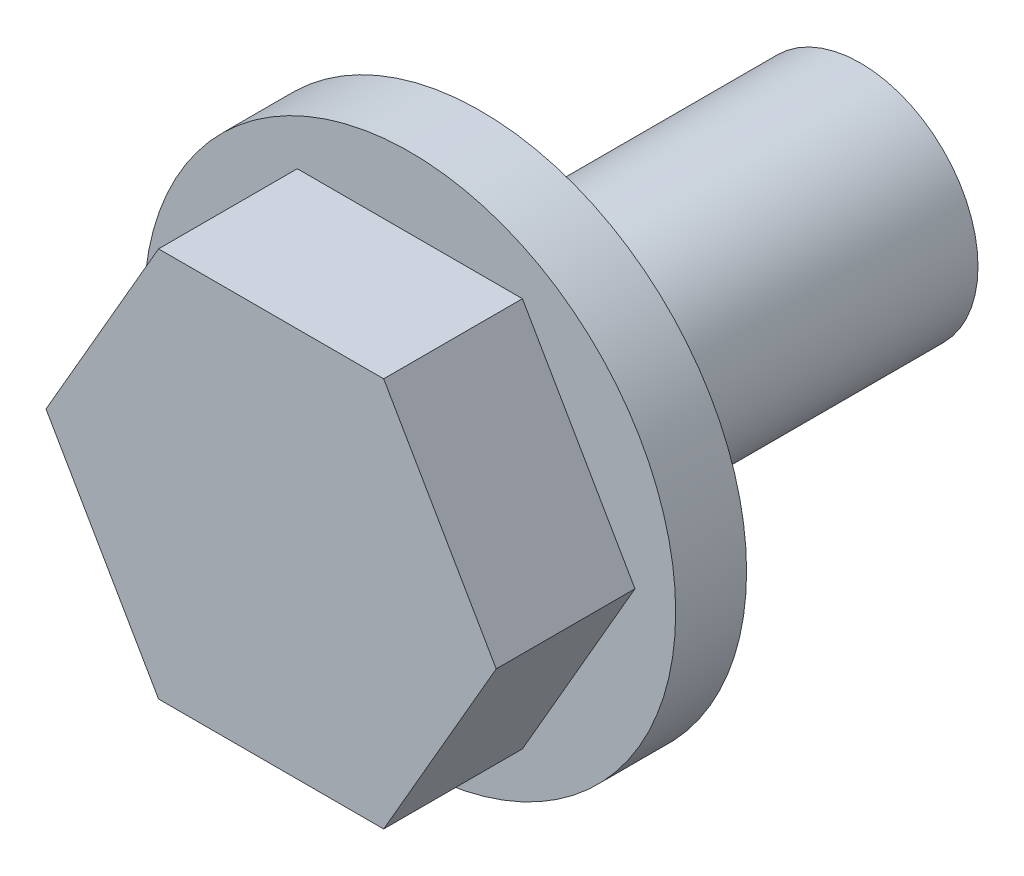
ISO-10303-21;
HEADER;
FILE_DESCRIPTION(('STEP AP214'),'2;1');
FILE_NAME('part.step','',(''),(''),'','','');
FILE_SCHEMA(('AUTOMOTIVE_DESIGN { 1 0 10303 214 1 1 1 1 }'));
ENDSEC;
DATA;
#1=APPLICATION_CONTEXT('core data for automotive mechanical design processes');
#2=APPLICATION_PROTOCOL_DEFINITION('international standard','automotive_design',2000,#1);
#3=PRODUCT_CONTEXT('',#1,'mechanical');
#4=PRODUCT('Part','Part','',(#3));
#5=PRODUCT_RELATED_PRODUCT_CATEGORY('part','',(#4));
#6=PRODUCT_DEFINITION_FORMATION('','',#4);
#7=PRODUCT_DEFINITION_CONTEXT('part definition',#1,'design');
#8=PRODUCT_DEFINITION('design','',#6,#7);
#9=PRODUCT_DEFINITION_SHAPE('','',#8);
#10=(LENGTH_UNIT() NAMED_UNIT(*) SI_UNIT(.MILLI.,.METRE.));
#11=(NAMED_UNIT(*) PLANE_ANGLE_UNIT() SI_UNIT($,.RADIAN.));
#12=(NAMED_UNIT(*) SI_UNIT($,.STERADIAN.) SOLID_ANGLE_UNIT());
#13=UNCERTAINTY_MEASURE_WITH_UNIT(LENGTH_MEASURE(1.E-05),#10,'distance_accuracy_value','');
#14=(GEOMETRIC_REPRESENTATION_CONTEXT(3) GLOBAL_UNCERTAINTY_ASSIGNED_CONTEXT((#13)) GLOBAL_UNIT_ASSIGNED_CONTEXT((#10,
#11,#12)) REPRESENTATION_CONTEXT('',''));
#15=CARTESIAN_POINT('',(0.,0.,0.));
#16=DIRECTION('',(0.,0.,1.));
#17=DIRECTION('',(1.,0.,0.));
#18=AXIS2_PLACEMENT_3D('',#15,#16,#17);
#19=CARTESIAN_POINT('',(0.,-9.779,5.2578));
#20=DIRECTION('',(0.,0.,-1.));
#21=DIRECTION('',(-1.,0.,0.));
#22=AXIS2_PLACEMENT_3D('',#19,#20,#21);
#23=PLANE('',#22);
#24=DIRECTION('',(-0.5,0.866025403784439,0.));
#25=VECTOR('',#24,1.);
#26=CARTESIAN_POINT('',(5.64590828240536,0.,5.2578));
#27=LINE('',#26,#25);
#28=CARTESIAN_POINT('',(2.82295414120268,4.8895,5.2578));
#29=VERTEX_POINT('',#28);
#30=CARTESIAN_POINT('',(5.64590828240536,0.,5.2578));
#31=VERTEX_POINT('',#30);
#32=EDGE_CURVE('E74',#29,#31,#27,.F.);
#33=ORIENTED_EDGE('',*,*,#32,.F.);
#34=DIRECTION('',(1.,0.,0.));
#35=VECTOR('',#34,1.);
#36=CARTESIAN_POINT('',(2.82295414120268,4.8895,5.2578));
#37=LINE('',#36,#35);
#38=CARTESIAN_POINT('',(-2.82295414120268,4.8895,5.2578));
#39=VERTEX_POINT('',#38);
#40=EDGE_CURVE('E71',#39,#29,#37,.T.);
#41=ORIENTED_EDGE('',*,*,#40,.F.);
#42=DIRECTION('',(-0.5,-0.866025403784439,0.));
#43=VECTOR('',#42,1.);
#44=CARTESIAN_POINT('',(-2.82295414120268,4.8895,5.2578));
#45=LINE('',#44,#43);
#46=CARTESIAN_POINT('',(-5.64590828240535,0.,5.2578));
#47=VERTEX_POINT('',#46);
#48=EDGE_CURVE('E68',#47,#39,#45,.F.);
#49=ORIENTED_EDGE('',*,*,#48,.F.);
#50=DIRECTION('',(0.5,-0.866025403784439,0.));
#51=VECTOR('',#50,1.);
#52=CARTESIAN_POINT('',(-5.64590828240535,0.,5.2578));
#53=LINE('',#52,#51);
#54=CARTESIAN_POINT('',(-2.82295414120267,-4.8895,5.2578));
#55=VERTEX_POINT('',#54);
#56=EDGE_CURVE('E85',#55,#47,#53,.F.);
#57=ORIENTED_EDGE('',*,*,#56,.F.);
#58=DIRECTION('',(1.,0.,0.));
#59=VECTOR('',#58,1.);
#60=CARTESIAN_POINT('',(-2.82295414120267,-4.8895,5.2578));
#61=LINE('',#60,#59);
#62=CARTESIAN_POINT('',(2.82295414120268,-4.8895,5.2578));
#63=VERTEX_POINT('',#62);
#64=EDGE_CURVE('E129',#63,#55,#61,.F.);
#65=ORIENTED_EDGE('',*,*,#64,.F.);
#66=DIRECTION('',(0.5,0.866025403784438,0.));
#67=VECTOR('',#66,1.);
#68=CARTESIAN_POINT('',(5.64590828240536,0.,5.2578));
#69=LINE('',#68,#67);
#70=EDGE_CURVE('E123',#31,#63,#69,.F.);
#71=ORIENTED_EDGE('',*,*,#70,.F.);
#72=EDGE_LOOP('',(#33,#41,#49,#57,#65,#71));
#73=FACE_BOUND('',#72,.T.);
#74=ADVANCED_FACE('F17',(#73),#23,.F.);
#75=CARTESIAN_POINT('',(2.82295414120268,4.8895,5.2578));
#76=DIRECTION('',(0.,1.,0.));
#77=DIRECTION('',(0.,0.,1.));
#78=AXIS2_PLACEMENT_3D('',#75,#76,#77);
#79=PLANE('',#78);
#80=ORIENTED_EDGE('',*,*,#40,.T.);
#81=DIRECTION('',(0.,0.,1.));
#82=VECTOR('',#81,1.);
#83=CARTESIAN_POINT('',(2.82295414120268,4.8895,5.2578));
#84=LINE('',#83,#82);
#85=CARTESIAN_POINT('',(2.82295414120268,4.8895,1.778));
#86=VERTEX_POINT('',#85);
#87=EDGE_CURVE('E119',#86,#29,#84,.T.);
#88=ORIENTED_EDGE('',*,*,#87,.F.);
#89=DIRECTION('',(-1.,0.,0.));
#90=VECTOR('',#89,1.);
#91=CARTESIAN_POINT('',(0.,4.8895,1.778));
#92=LINE('',#91,#90);
#93=CARTESIAN_POINT('',(-2.82295414120268,4.8895,1.778));
#94=VERTEX_POINT('',#93);
#95=EDGE_CURVE('E82',#86,#94,#92,.T.);
#96=ORIENTED_EDGE('',*,*,#95,.T.);
#97=DIRECTION('',(0.,0.,1.));
#98=VECTOR('',#97,1.);
#99=CARTESIAN_POINT('',(-2.82295414120268,4.8895,5.2578));
#100=LINE('',#99,#98);
#101=EDGE_CURVE('E79',#39,#94,#100,.F.);
#102=ORIENTED_EDGE('',*,*,#101,.F.);
#103=EDGE_LOOP('',(#80,#88,#96,#102));
#104=FACE_BOUND('',#103,.T.);
#105=ADVANCED_FACE('F80',(#104),#79,.T.);
#106=CARTESIAN_POINT('',(-2.82295414120268,4.8895,5.2578));
#107=DIRECTION('',(-0.866025403784439,0.5,0.));
#108=DIRECTION('',(-0.5,-0.866025403784439,0.));
#109=AXIS2_PLACEMENT_3D('',#106,#107,#108);
#110=PLANE('',#109);
#111=ORIENTED_EDGE('',*,*,#48,.T.);
#112=ORIENTED_EDGE('',*,*,#101,.T.);
#113=DIRECTION('',(-0.499999999999999,-0.866025403784439,0.));
#114=VECTOR('',#113,1.);
#115=CARTESIAN_POINT('',(-2.82295414120268,4.8895,1.778));
#116=LINE('',#115,#114);
#117=CARTESIAN_POINT('',(-5.64590828240535,0.,1.778));
#118=VERTEX_POINT('',#117);
#119=EDGE_CURVE('E113',#94,#118,#116,.T.);
#120=ORIENTED_EDGE('',*,*,#119,.T.);
#121=DIRECTION('',(0.,0.,1.));
#122=VECTOR('',#121,1.);
#123=CARTESIAN_POINT('',(-5.64590828240535,0.,5.2578));
#124=LINE('',#123,#122);
#125=EDGE_CURVE('E89',#47,#118,#124,.F.);
#126=ORIENTED_EDGE('',*,*,#125,.F.);
#127=EDGE_LOOP('',(#111,#112,#120,#126));
#128=FACE_BOUND('',#127,.T.);
#129=ADVANCED_FACE('F87',(#128),#110,.T.);
#130=CARTESIAN_POINT('',(-5.64590828240535,0.,5.2578));
#131=DIRECTION('',(-0.866025403784439,-0.5,0.));
#132=DIRECTION('',(0.5,-0.866025403784439,0.));
#133=AXIS2_PLACEMENT_3D('',#130,#131,#132);
#134=PLANE('',#133);
#135=ORIENTED_EDGE('',*,*,#56,.T.);
#136=ORIENTED_EDGE('',*,*,#125,.T.);
#137=DIRECTION('',(0.500000000000001,-0.866025403784438,0.));
#138=VECTOR('',#137,1.);
#139=CARTESIAN_POINT('',(-5.64590828240535,0.,1.778));
#140=LINE('',#139,#138);
#141=CARTESIAN_POINT('',(-2.82295414120267,-4.8895,1.778));
#142=VERTEX_POINT('',#141);
#143=EDGE_CURVE('E111',#118,#142,#140,.T.);
#144=ORIENTED_EDGE('',*,*,#143,.T.);
#145=DIRECTION('',(0.,0.,-1.));
#146=VECTOR('',#145,1.);
#147=CARTESIAN_POINT('',(-2.82295414120267,-4.8895,5.2578));
#148=LINE('',#147,#146);
#149=EDGE_CURVE('E126',#55,#142,#148,.T.);
#150=ORIENTED_EDGE('',*,*,#149,.F.);
#151=EDGE_LOOP('',(#135,#136,#144,#150));
#152=FACE_BOUND('',#151,.T.);
#153=ADVANCED_FACE('F134',(#152),#134,.T.);
#154=CARTESIAN_POINT('',(-2.82295414120267,-4.8895,5.2578));
#155=DIRECTION('',(0.,-1.,0.));
#156=DIRECTION('',(0.,0.,-1.));
#157=AXIS2_PLACEMENT_3D('',#154,#155,#156);
#158=PLANE('',#157);
#159=ORIENTED_EDGE('',*,*,#64,.T.);
#160=ORIENTED_EDGE('',*,*,#149,.T.);
#161=DIRECTION('',(-1.,0.,0.));
#162=VECTOR('',#161,1.);
#163=CARTESIAN_POINT('',(0.,-4.8895,1.778));
#164=LINE('',#163,#162);
#165=CARTESIAN_POINT('',(2.82295414120268,-4.8895,1.778));
#166=VERTEX_POINT('',#165);
#167=EDGE_CURVE('E107',#142,#166,#164,.F.);
#168=ORIENTED_EDGE('',*,*,#167,.T.);
#169=DIRECTION('',(0.,0.,1.));
#170=VECTOR('',#169,1.);
#171=CARTESIAN_POINT('',(2.82295414120268,-4.8895,5.2578));
#172=LINE('',#171,#170);
#173=EDGE_CURVE('E121',#63,#166,#172,.F.);
#174=ORIENTED_EDGE('',*,*,#173,.F.);
#175=EDGE_LOOP('',(#159,#160,#168,#174));
#176=FACE_BOUND('',#175,.T.);
#177=ADVANCED_FACE('F138',(#176),#158,.T.);
#178=CARTESIAN_POINT('',(5.64590828240536,0.,5.2578));
#179=DIRECTION('',(0.866025403784438,-0.5,0.));
#180=DIRECTION('',(0.5,0.866025403784438,0.));
#181=AXIS2_PLACEMENT_3D('',#178,#179,#180);
#182=PLANE('',#181);
#183=ORIENTED_EDGE('',*,*,#70,.T.);
#184=ORIENTED_EDGE('',*,*,#173,.T.);
#185=DIRECTION('',(0.500000000000001,0.866025403784438,0.));
#186=VECTOR('',#185,1.);
#187=CARTESIAN_POINT('',(2.82295414120268,-4.8895,1.778));
#188=LINE('',#187,#186);
#189=CARTESIAN_POINT('',(5.64590828240536,0.,1.778));
#190=VERTEX_POINT('',#189);
#191=EDGE_CURVE('E35',#166,#190,#188,.T.);
#192=ORIENTED_EDGE('',*,*,#191,.T.);
#193=DIRECTION('',(0.,0.,1.));
#194=VECTOR('',#193,1.);
#195=CARTESIAN_POINT('',(5.64590828240536,0.,5.2578));
#196=LINE('',#195,#194);
#197=EDGE_CURVE('E116',#31,#190,#196,.F.);
#198=ORIENTED_EDGE('',*,*,#197,.F.);
#199=EDGE_LOOP('',(#183,#184,#192,#198));
#200=FACE_BOUND('',#199,.T.);
#201=ADVANCED_FACE('F140',(#200),#182,.T.);
#202=CARTESIAN_POINT('',(5.64590828240536,0.,5.2578));
#203=DIRECTION('',(0.866025403784439,0.5,0.));
#204=DIRECTION('',(-0.5,0.866025403784439,0.));
#205=AXIS2_PLACEMENT_3D('',#202,#203,#204);
#206=PLANE('',#205);
#207=ORIENTED_EDGE('',*,*,#32,.T.);
#208=ORIENTED_EDGE('',*,*,#197,.T.);
#209=DIRECTION('',(-0.5,0.866025403784438,0.));
#210=VECTOR('',#209,1.);
#211=CARTESIAN_POINT('',(5.64590828240536,0.,1.778));
#212=LINE('',#211,#210);
#213=EDGE_CURVE('E100',#190,#86,#212,.T.);
#214=ORIENTED_EDGE('',*,*,#213,.T.);
#215=ORIENTED_EDGE('',*,*,#87,.T.);
#216=EDGE_LOOP('',(#207,#208,#214,#215));
#217=FACE_BOUND('',#216,.T.);
#218=ADVANCED_FACE('F141',(#217),#206,.T.);
#219=CARTESIAN_POINT('',(0.,0.,1.778));
#220=DIRECTION('',(0.,0.,-1.));
#221=DIRECTION('',(-1.,0.,0.));
#222=AXIS2_PLACEMENT_3D('',#219,#220,#221);
#223=PLANE('',#222);
#224=CARTESIAN_POINT('',(0.,0.,1.778));
#225=DIRECTION('',(0.,0.,1.));
#226=DIRECTION('',(1.,0.,0.));
#227=AXIS2_PLACEMENT_3D('',#224,#225,#226);
#228=CIRCLE('',#227,6.6675);
#229=CARTESIAN_POINT('',(6.6675,0.,1.778));
#230=VERTEX_POINT('',#229);
#231=EDGE_CURVE('E20',#230,#230,#228,.F.);
#232=ORIENTED_EDGE('',*,*,#231,.F.);
#233=EDGE_LOOP('',(#232));
#234=FACE_BOUND('',#233,.T.);
#235=ORIENTED_EDGE('',*,*,#191,.F.);
#236=ORIENTED_EDGE('',*,*,#167,.F.);
#237=ORIENTED_EDGE('',*,*,#143,.F.);
#238=ORIENTED_EDGE('',*,*,#119,.F.);
#239=ORIENTED_EDGE('',*,*,#95,.F.);
#240=ORIENTED_EDGE('',*,*,#213,.F.);
#241=EDGE_LOOP('',(#235,#236,#237,#238,#239,#240));
#242=FACE_BOUND('',#241,.T.);
#243=ADVANCED_FACE('F143',(#234,#242),#223,.F.);
#244=CARTESIAN_POINT('',(0.,0.,1.778));
#245=DIRECTION('',(0.,0.,1.));
#246=DIRECTION('',(1.,0.,0.));
#247=AXIS2_PLACEMENT_3D('',#244,#245,#246);
#248=CYLINDRICAL_SURFACE('',#247,6.6675);
#249=CARTESIAN_POINT('',(0.,0.,0.));
#250=DIRECTION('',(0.,0.,1.));
#251=DIRECTION('',(1.,0.,0.));
#252=AXIS2_PLACEMENT_3D('',#249,#250,#251);
#253=CIRCLE('',#252,6.6675);
#254=CARTESIAN_POINT('',(6.6675,0.,0.));
#255=VERTEX_POINT('',#254);
#256=EDGE_CURVE('E95',#255,#255,#253,.F.);
#257=ORIENTED_EDGE('',*,*,#256,.F.);
#258=EDGE_LOOP('',(#257));
#259=FACE_BOUND('',#258,.T.);
#260=ORIENTED_EDGE('',*,*,#231,.T.);
#261=EDGE_LOOP('',(#260));
#262=FACE_BOUND('',#261,.T.);
#263=ADVANCED_FACE('F150',(#259,#262),#248,.T.);
#264=CARTESIAN_POINT('',(0.,0.,-9.525));
#265=DIRECTION('',(0.,0.,-1.));
#266=DIRECTION('',(-1.,0.,0.));
#267=AXIS2_PLACEMENT_3D('',#264,#265,#266);
#268=PLANE('',#267);
#269=CARTESIAN_POINT('',(0.,0.,-9.525));
#270=DIRECTION('',(0.,0.,-1.));
#271=DIRECTION('',(-1.,0.,0.));
#272=AXIS2_PLACEMENT_3D('',#269,#270,#271);
#273=CIRCLE('',#272,2.9464);
#274=CARTESIAN_POINT('',(-2.9464,0.,-9.525));
#275=VERTEX_POINT('',#274);
#276=EDGE_CURVE('E26',#275,#275,#273,.F.);
#277=ORIENTED_EDGE('',*,*,#276,.F.);
#278=EDGE_LOOP('',(#277));
#279=FACE_BOUND('',#278,.T.);
#280=ADVANCED_FACE('F162',(#279),#268,.T.);
#281=CARTESIAN_POINT('',(0.,0.,0.));
#282=DIRECTION('',(0.,0.,-1.));
#283=DIRECTION('',(-1.,0.,0.));
#284=AXIS2_PLACEMENT_3D('',#281,#282,#283);
#285=PLANE('',#284);
#286=CARTESIAN_POINT('',(0.,0.,0.));
#287=DIRECTION('',(0.,0.,-1.));
#288=DIRECTION('',(-1.,0.,0.));
#289=AXIS2_PLACEMENT_3D('',#286,#287,#288);
#290=CIRCLE('',#289,2.9464);
#291=CARTESIAN_POINT('',(-2.9464,0.,0.));
#292=VERTEX_POINT('',#291);
#293=EDGE_CURVE('E11',#292,#292,#290,.T.);
#294=ORIENTED_EDGE('',*,*,#293,.F.);
#295=EDGE_LOOP('',(#294));
#296=FACE_BOUND('',#295,.T.);
#297=ORIENTED_EDGE('',*,*,#256,.T.);
#298=EDGE_LOOP('',(#297));
#299=FACE_BOUND('',#298,.T.);
#300=ADVANCED_FACE('F156',(#296,#299),#285,.T.);
#301=CARTESIAN_POINT('',(0.,0.,-9.525));
#302=DIRECTION('',(0.,0.,-1.));
#303=DIRECTION('',(-1.,0.,0.));
#304=AXIS2_PLACEMENT_3D('',#301,#302,#303);
#305=CYLINDRICAL_SURFACE('',#304,2.9464);
#306=ORIENTED_EDGE('',*,*,#293,.T.);
#307=EDGE_LOOP('',(#306));
#308=FACE_BOUND('',#307,.T.);
#309=ORIENTED_EDGE('',*,*,#276,.T.);
#310=EDGE_LOOP('',(#309));
#311=FACE_BOUND('',#310,.T.);
#312=ADVANCED_FACE('F154',(#308,#311),#305,.T.);
#313=CLOSED_SHELL('',(#74,#105,#129,#153,#177,#201,#218,#243,#263,#280,#300,#312));
#314=MANIFOLD_SOLID_BREP('B1',#313);
#315=ADVANCED_BREP_SHAPE_REPRESENTATION('',(#18,#314),#14);
#316=SHAPE_DEFINITION_REPRESENTATION(#9,#315);
ENDSEC;
END-ISO-10303-21;
